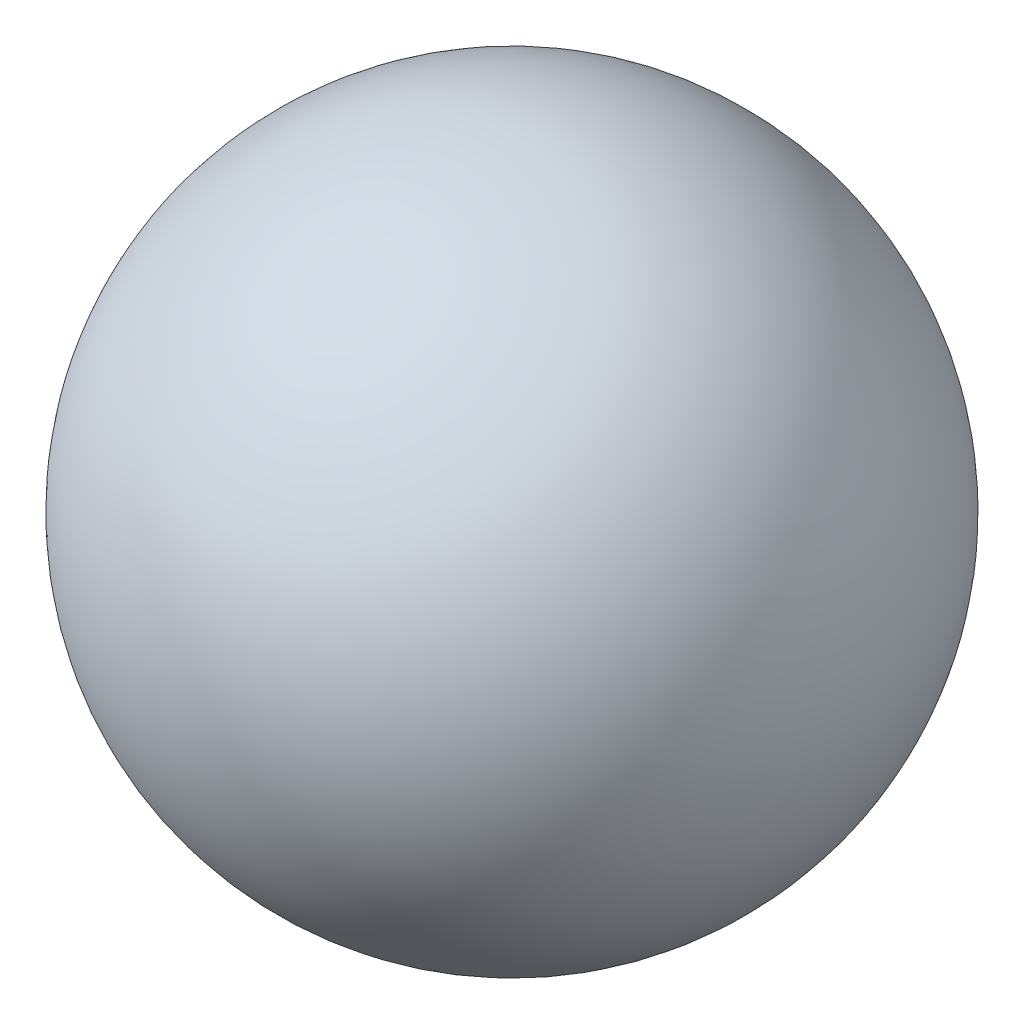
ISO-10303-21;
HEADER;
FILE_DESCRIPTION(('STEP AP214'),'2;1');
FILE_NAME('part.step','',(''),(''),'','','');
FILE_SCHEMA(('AUTOMOTIVE_DESIGN { 1 0 10303 214 1 1 1 1 }'));
ENDSEC;
DATA;
#1=APPLICATION_CONTEXT('core data for automotive mechanical design processes');
#2=APPLICATION_PROTOCOL_DEFINITION('international standard','automotive_design',2000,#1);
#3=PRODUCT_CONTEXT('',#1,'mechanical');
#4=PRODUCT('Part','Part','',(#3));
#5=PRODUCT_RELATED_PRODUCT_CATEGORY('part','',(#4));
#6=PRODUCT_DEFINITION_FORMATION('','',#4);
#7=PRODUCT_DEFINITION_CONTEXT('part definition',#1,'design');
#8=PRODUCT_DEFINITION('design','',#6,#7);
#9=PRODUCT_DEFINITION_SHAPE('','',#8);
#10=(LENGTH_UNIT() NAMED_UNIT(*) SI_UNIT(.MILLI.,.METRE.));
#11=(NAMED_UNIT(*) PLANE_ANGLE_UNIT() SI_UNIT($,.RADIAN.));
#12=(NAMED_UNIT(*) SI_UNIT($,.STERADIAN.) SOLID_ANGLE_UNIT());
#13=UNCERTAINTY_MEASURE_WITH_UNIT(LENGTH_MEASURE(1.E-05),#10,'distance_accuracy_value','');
#14=(GEOMETRIC_REPRESENTATION_CONTEXT(3) GLOBAL_UNCERTAINTY_ASSIGNED_CONTEXT((#13)) GLOBAL_UNIT_ASSIGNED_CONTEXT((#10,
#11,#12)) REPRESENTATION_CONTEXT('',''));
#15=CARTESIAN_POINT('',(0.,0.,0.));
#16=DIRECTION('',(0.,0.,1.));
#17=DIRECTION('',(1.,0.,0.));
#18=AXIS2_PLACEMENT_3D('',#15,#16,#17);
#19=CARTESIAN_POINT('',(0.,0.,0.));
#20=DIRECTION('',(-1.,0.,0.));
#21=DIRECTION('',(0.,1.,0.));
#22=AXIS2_PLACEMENT_3D('',#19,#20,#21);
#23=SPHERICAL_SURFACE('',#22,4.76);
#24=CARTESIAN_POINT('',(-4.76,0.,0.));
#25=VERTEX_POINT('',#24);
#26=VERTEX_LOOP('',#25);
#27=FACE_BOUND('',#26,.T.);
#28=ADVANCED_FACE('F28',(#27),#23,.T.);
#29=CLOSED_SHELL('',(#28));
#30=MANIFOLD_SOLID_BREP('B2',#29);
#31=ADVANCED_BREP_SHAPE_REPRESENTATION('',(#18,#30),#14);
#32=SHAPE_DEFINITION_REPRESENTATION(#9,#31);
ENDSEC;
END-ISO-10303-21;
